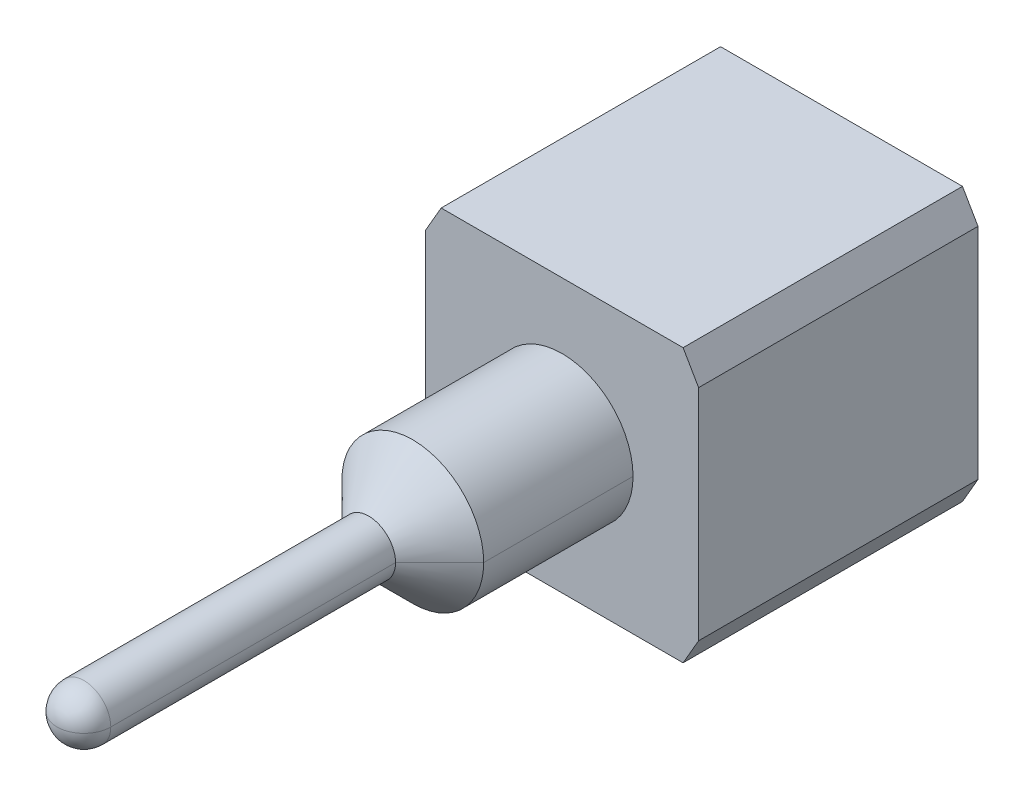
ISO-10303-21;
HEADER;
FILE_DESCRIPTION(('STEP AP214'),'2;1');
FILE_NAME('part.step','',(''),(''),'','','');
FILE_SCHEMA(('AUTOMOTIVE_DESIGN { 1 0 10303 214 1 1 1 1 }'));
ENDSEC;
DATA;
#1=APPLICATION_CONTEXT('core data for automotive mechanical design processes');
#2=APPLICATION_PROTOCOL_DEFINITION('international standard','automotive_design',2000,#1);
#3=PRODUCT_CONTEXT('',#1,'mechanical');
#4=PRODUCT('Part','Part','',(#3));
#5=PRODUCT_RELATED_PRODUCT_CATEGORY('part','',(#4));
#6=PRODUCT_DEFINITION_FORMATION('','',#4);
#7=PRODUCT_DEFINITION_CONTEXT('part definition',#1,'design');
#8=PRODUCT_DEFINITION('design','',#6,#7);
#9=PRODUCT_DEFINITION_SHAPE('','',#8);
#10=(LENGTH_UNIT() NAMED_UNIT(*) SI_UNIT(.MILLI.,.METRE.));
#11=(NAMED_UNIT(*) PLANE_ANGLE_UNIT() SI_UNIT($,.RADIAN.));
#12=(NAMED_UNIT(*) SI_UNIT($,.STERADIAN.) SOLID_ANGLE_UNIT());
#13=UNCERTAINTY_MEASURE_WITH_UNIT(LENGTH_MEASURE(1.E-05),#10,'distance_accuracy_value','');
#14=(GEOMETRIC_REPRESENTATION_CONTEXT(3) GLOBAL_UNCERTAINTY_ASSIGNED_CONTEXT((#13)) GLOBAL_UNIT_ASSIGNED_CONTEXT((#10,
#11,#12)) REPRESENTATION_CONTEXT('',''));
#15=CARTESIAN_POINT('',(0.,0.,0.));
#16=DIRECTION('',(0.,0.,1.));
#17=DIRECTION('',(1.,0.,0.));
#18=AXIS2_PLACEMENT_3D('',#15,#16,#17);
#19=CARTESIAN_POINT('',(22.86,0.,-2.434999997027));
#20=DIRECTION('',(0.,0.,-1.));
#21=DIRECTION('',(0.,-1.,0.));
#22=AXIS2_PLACEMENT_3D('',#19,#20,#21);
#23=CONICAL_SURFACE('',#22,0.484999997027,0.785398163397);
#24=CARTESIAN_POINT('',(22.86,0.,-2.27));
#25=DIRECTION('',(0.,0.,1.));
#26=DIRECTION('',(-1.,0.,0.));
#27=AXIS2_PLACEMENT_3D('',#24,#25,#26);
#28=CIRCLE('',#27,0.32);
#29=CARTESIAN_POINT('',(22.54,0.,-2.27));
#30=VERTEX_POINT('',#29);
#31=CARTESIAN_POINT('',(22.86,-0.32,-2.27));
#32=VERTEX_POINT('',#31);
#33=EDGE_CURVE('E225',#30,#32,#28,.T.);
#34=ORIENTED_EDGE('',*,*,#33,.T.);
#35=DIRECTION('',(0.,-0.707106781186048,-0.707106781187048));
#36=VECTOR('',#35,1.);
#37=CARTESIAN_POINT('',(22.86,-0.484999997027,-2.434999997027));
#38=LINE('',#37,#36);
#39=CARTESIAN_POINT('',(22.86,-0.65,-2.6));
#40=VERTEX_POINT('',#39);
#41=EDGE_CURVE('E295',#32,#40,#38,.T.);
#42=ORIENTED_EDGE('',*,*,#41,.T.);
#43=CARTESIAN_POINT('',(22.86,0.,-2.6));
#44=DIRECTION('',(0.,0.,1.));
#45=DIRECTION('',(-1.,0.,0.));
#46=AXIS2_PLACEMENT_3D('',#43,#44,#45);
#47=CIRCLE('',#46,0.65);
#48=CARTESIAN_POINT('',(22.21,0.,-2.6));
#49=VERTEX_POINT('',#48);
#50=EDGE_CURVE('E204',#49,#40,#47,.T.);
#51=ORIENTED_EDGE('',*,*,#50,.F.);
#52=DIRECTION('',(0.707106781186046,-7.14491332818146E-08,0.707106781187046));
#53=VECTOR('',#52,1.);
#54=CARTESIAN_POINT('',(22.21000000517,5.286343726844E-08,-2.599999994828));
#55=LINE('',#54,#53);
#56=EDGE_CURVE('E197',#49,#30,#55,.T.);
#57=ORIENTED_EDGE('',*,*,#56,.T.);
#58=EDGE_LOOP('',(#34,#42,#51,#57));
#59=FACE_BOUND('',#58,.T.);
#60=ADVANCED_FACE('F16',(#59),#23,.F.);
#61=CARTESIAN_POINT('',(22.86,0.,4.45));
#62=DIRECTION('',(0.,0.,1.));
#63=DIRECTION('',(1.,0.,0.));
#64=AXIS2_PLACEMENT_3D('',#61,#62,#63);
#65=SPHERICAL_SURFACE('',#64,0.25);
#66=CARTESIAN_POINT('',(22.86,0.,4.45));
#67=DIRECTION('',(0.,-1.,0.));
#68=DIRECTION('',(0.,0.,1.));
#69=AXIS2_PLACEMENT_3D('',#66,#67,#68);
#70=CIRCLE('',#69,0.25);
#71=CARTESIAN_POINT('',(22.86,0.,4.7));
#72=VERTEX_POINT('',#71);
#73=CARTESIAN_POINT('',(22.61,0.,4.45));
#74=VERTEX_POINT('',#73);
#75=EDGE_CURVE('E27',#72,#74,#70,.T.);
#76=ORIENTED_EDGE('',*,*,#75,.T.);
#77=CARTESIAN_POINT('',(22.86,0.,4.45));
#78=DIRECTION('',(0.,0.,-1.));
#79=DIRECTION('',(1.,0.,0.));
#80=AXIS2_PLACEMENT_3D('',#77,#78,#79);
#81=CIRCLE('',#80,0.25);
#82=CARTESIAN_POINT('',(23.11,0.,4.45));
#83=VERTEX_POINT('',#82);
#84=EDGE_CURVE('E246',#83,#74,#81,.T.);
#85=ORIENTED_EDGE('',*,*,#84,.F.);
#86=CARTESIAN_POINT('',(22.86,0.,4.45));
#87=DIRECTION('',(0.,-1.,0.));
#88=DIRECTION('',(0.,0.,1.));
#89=AXIS2_PLACEMENT_3D('',#86,#87,#88);
#90=CIRCLE('',#89,0.25);
#91=EDGE_CURVE('E10',#83,#72,#90,.T.);
#92=ORIENTED_EDGE('',*,*,#91,.T.);
#93=EDGE_LOOP('',(#76,#85,#92));
#94=FACE_BOUND('',#93,.T.);
#95=ADVANCED_FACE('F455',(#94),#65,.T.);
#96=CARTESIAN_POINT('',(22.86,0.,4.45));
#97=DIRECTION('',(0.,0.,1.));
#98=DIRECTION('',(1.,0.,0.));
#99=AXIS2_PLACEMENT_3D('',#96,#97,#98);
#100=SPHERICAL_SURFACE('',#99,0.25);
#101=CARTESIAN_POINT('',(22.86,0.,4.45));
#102=DIRECTION('',(0.,0.,1.));
#103=DIRECTION('',(1.,0.,0.));
#104=AXIS2_PLACEMENT_3D('',#101,#102,#103);
#105=CIRCLE('',#104,0.25);
#106=EDGE_CURVE('E291',#83,#74,#105,.T.);
#107=ORIENTED_EDGE('',*,*,#106,.T.);
#108=ORIENTED_EDGE('',*,*,#75,.F.);
#109=ORIENTED_EDGE('',*,*,#91,.F.);
#110=EDGE_LOOP('',(#107,#108,#109));
#111=FACE_BOUND('',#110,.T.);
#112=ADVANCED_FACE('F448',(#111),#100,.T.);
#113=CARTESIAN_POINT('',(22.86,0.,4.935));
#114=DIRECTION('',(0.,0.,-1.));
#115=DIRECTION('',(1.,0.,0.));
#116=AXIS2_PLACEMENT_3D('',#113,#114,#115);
#117=CYLINDRICAL_SURFACE('',#116,0.25);
#118=CARTESIAN_POINT('',(22.86,0.,1.8));
#119=DIRECTION('',(0.,0.,1.));
#120=DIRECTION('',(1.,0.,0.));
#121=AXIS2_PLACEMENT_3D('',#118,#119,#120);
#122=CIRCLE('',#121,0.25);
#123=CARTESIAN_POINT('',(23.11,0.,1.8));
#124=VERTEX_POINT('',#123);
#125=CARTESIAN_POINT('',(22.61,0.,1.8));
#126=VERTEX_POINT('',#125);
#127=EDGE_CURVE('E304',#124,#126,#122,.T.);
#128=ORIENTED_EDGE('',*,*,#127,.T.);
#129=DIRECTION('',(0.,0.,-1.));
#130=VECTOR('',#129,1.);
#131=CARTESIAN_POINT('',(22.61,0.,4.45));
#132=LINE('',#131,#130);
#133=EDGE_CURVE('E318',#74,#126,#132,.T.);
#134=ORIENTED_EDGE('',*,*,#133,.F.);
#135=ORIENTED_EDGE('',*,*,#106,.F.);
#136=DIRECTION('',(0.,0.,-1.));
#137=VECTOR('',#136,1.);
#138=CARTESIAN_POINT('',(23.11,0.,4.45));
#139=LINE('',#138,#137);
#140=EDGE_CURVE('E373',#83,#124,#139,.T.);
#141=ORIENTED_EDGE('',*,*,#140,.T.);
#142=EDGE_LOOP('',(#128,#134,#135,#141));
#143=FACE_BOUND('',#142,.T.);
#144=ADVANCED_FACE('F443',(#143),#117,.T.);
#145=CARTESIAN_POINT('',(22.86,0.,4.935));
#146=DIRECTION('',(0.,0.,-1.));
#147=DIRECTION('',(1.,0.,0.));
#148=AXIS2_PLACEMENT_3D('',#145,#146,#147);
#149=CYLINDRICAL_SURFACE('',#148,0.25);
#150=ORIENTED_EDGE('',*,*,#84,.T.);
#151=ORIENTED_EDGE('',*,*,#133,.T.);
#152=CARTESIAN_POINT('',(22.86,0.,1.8));
#153=DIRECTION('',(0.,0.,-1.));
#154=DIRECTION('',(1.,0.,0.));
#155=AXIS2_PLACEMENT_3D('',#152,#153,#154);
#156=CIRCLE('',#155,0.25);
#157=EDGE_CURVE('E242',#124,#126,#156,.T.);
#158=ORIENTED_EDGE('',*,*,#157,.F.);
#159=ORIENTED_EDGE('',*,*,#140,.F.);
#160=EDGE_LOOP('',(#150,#151,#158,#159));
#161=FACE_BOUND('',#160,.T.);
#162=ADVANCED_FACE('F447',(#161),#149,.T.);
#163=CARTESIAN_POINT('',(22.86,0.,1.595));
#164=DIRECTION('',(0.,0.,-1.));
#165=DIRECTION('',(1.,0.,0.));
#166=AXIS2_PLACEMENT_3D('',#163,#164,#165);
#167=CONICAL_SURFACE('',#166,0.455,0.785398163397);
#168=ORIENTED_EDGE('',*,*,#157,.T.);
#169=DIRECTION('',(-0.707106781186048,0.,-0.707106781187048));
#170=VECTOR('',#169,1.);
#171=CARTESIAN_POINT('',(22.61,0.,1.8));
#172=LINE('',#171,#170);
#173=CARTESIAN_POINT('',(22.2,0.,1.39));
#174=VERTEX_POINT('',#173);
#175=EDGE_CURVE('E240',#126,#174,#172,.T.);
#176=ORIENTED_EDGE('',*,*,#175,.T.);
#177=CARTESIAN_POINT('',(22.86,0.,1.39));
#178=DIRECTION('',(0.,0.,-1.));
#179=DIRECTION('',(1.,0.,0.));
#180=AXIS2_PLACEMENT_3D('',#177,#178,#179);
#181=CIRCLE('',#180,0.66);
#182=CARTESIAN_POINT('',(23.52,0.,1.39));
#183=VERTEX_POINT('',#182);
#184=EDGE_CURVE('E254',#183,#174,#181,.T.);
#185=ORIENTED_EDGE('',*,*,#184,.F.);
#186=DIRECTION('',(0.707106781186548,0.,-0.707106781186548));
#187=VECTOR('',#186,1.);
#188=CARTESIAN_POINT('',(23.11,0.,1.8));
#189=LINE('',#188,#187);
#190=EDGE_CURVE('E247',#124,#183,#189,.T.);
#191=ORIENTED_EDGE('',*,*,#190,.F.);
#192=EDGE_LOOP('',(#168,#176,#185,#191));
#193=FACE_BOUND('',#192,.T.);
#194=ADVANCED_FACE('F435',(#193),#167,.T.);
#195=CARTESIAN_POINT('',(22.86,0.,1.595));
#196=DIRECTION('',(0.,0.,-1.));
#197=DIRECTION('',(1.,0.,0.));
#198=AXIS2_PLACEMENT_3D('',#195,#196,#197);
#199=CONICAL_SURFACE('',#198,0.455,0.785398163397);
#200=CARTESIAN_POINT('',(22.86,0.,1.39));
#201=DIRECTION('',(0.,0.,1.));
#202=DIRECTION('',(1.,0.,0.));
#203=AXIS2_PLACEMENT_3D('',#200,#201,#202);
#204=CIRCLE('',#203,0.66);
#205=EDGE_CURVE('E236',#183,#174,#204,.T.);
#206=ORIENTED_EDGE('',*,*,#205,.T.);
#207=ORIENTED_EDGE('',*,*,#175,.F.);
#208=ORIENTED_EDGE('',*,*,#127,.F.);
#209=ORIENTED_EDGE('',*,*,#190,.T.);
#210=EDGE_LOOP('',(#206,#207,#208,#209));
#211=FACE_BOUND('',#210,.T.);
#212=ADVANCED_FACE('F428',(#211),#199,.T.);
#213=CARTESIAN_POINT('',(22.86,0.,4.935));
#214=DIRECTION('',(0.,0.,-1.));
#215=DIRECTION('',(1.,0.,0.));
#216=AXIS2_PLACEMENT_3D('',#213,#214,#215);
#217=CYLINDRICAL_SURFACE('',#216,0.66);
#218=CARTESIAN_POINT('',(22.86,0.,0.));
#219=DIRECTION('',(0.,0.,-1.));
#220=DIRECTION('',(-1.,0.,0.));
#221=AXIS2_PLACEMENT_3D('',#218,#219,#220);
#222=CIRCLE('',#221,0.66);
#223=CARTESIAN_POINT('',(22.2,0.,0.));
#224=VERTEX_POINT('',#223);
#225=CARTESIAN_POINT('',(23.52,0.,0.));
#226=VERTEX_POINT('',#225);
#227=EDGE_CURVE('E231',#224,#226,#222,.T.);
#228=ORIENTED_EDGE('',*,*,#227,.F.);
#229=DIRECTION('',(0.,0.,-1.));
#230=VECTOR('',#229,1.);
#231=CARTESIAN_POINT('',(22.2,0.,1.39));
#232=LINE('',#231,#230);
#233=EDGE_CURVE('E258',#174,#224,#232,.T.);
#234=ORIENTED_EDGE('',*,*,#233,.F.);
#235=ORIENTED_EDGE('',*,*,#205,.F.);
#236=DIRECTION('',(0.,0.,-1.));
#237=VECTOR('',#236,1.);
#238=CARTESIAN_POINT('',(23.52,0.,1.39));
#239=LINE('',#238,#237);
#240=EDGE_CURVE('E241',#183,#226,#239,.T.);
#241=ORIENTED_EDGE('',*,*,#240,.T.);
#242=EDGE_LOOP('',(#228,#234,#235,#241));
#243=FACE_BOUND('',#242,.T.);
#244=ADVANCED_FACE('F434',(#243),#217,.T.);
#245=CARTESIAN_POINT('',(22.86,0.,4.935));
#246=DIRECTION('',(0.,0.,-1.));
#247=DIRECTION('',(1.,0.,0.));
#248=AXIS2_PLACEMENT_3D('',#245,#246,#247);
#249=CYLINDRICAL_SURFACE('',#248,0.66);
#250=ORIENTED_EDGE('',*,*,#184,.T.);
#251=ORIENTED_EDGE('',*,*,#233,.T.);
#252=CARTESIAN_POINT('',(22.86,0.,0.));
#253=DIRECTION('',(0.,0.,-1.));
#254=DIRECTION('',(1.,0.,0.));
#255=AXIS2_PLACEMENT_3D('',#252,#253,#254);
#256=CIRCLE('',#255,0.66);
#257=EDGE_CURVE('E220',#226,#224,#256,.T.);
#258=ORIENTED_EDGE('',*,*,#257,.F.);
#259=ORIENTED_EDGE('',*,*,#240,.F.);
#260=EDGE_LOOP('',(#250,#251,#258,#259));
#261=FACE_BOUND('',#260,.T.);
#262=ADVANCED_FACE('F593',(#261),#249,.T.);
#263=CARTESIAN_POINT('',(22.86,0.,-1.6));
#264=DIRECTION('',(0.,0.,-1.));
#265=DIRECTION('',(0.,-1.,0.));
#266=AXIS2_PLACEMENT_3D('',#263,#264,#265);
#267=PLANE('',#266);
#268=CARTESIAN_POINT('',(22.86,0.,-1.6));
#269=DIRECTION('',(0.,0.,-1.));
#270=DIRECTION('',(-1.,0.,0.));
#271=AXIS2_PLACEMENT_3D('',#268,#269,#270);
#272=CIRCLE('',#271,0.32);
#273=CARTESIAN_POINT('',(22.54,0.,-1.6));
#274=VERTEX_POINT('',#273);
#275=CARTESIAN_POINT('',(23.18,0.,-1.6));
#276=VERTEX_POINT('',#275);
#277=EDGE_CURVE('E259',#274,#276,#272,.T.);
#278=ORIENTED_EDGE('',*,*,#277,.T.);
#279=CARTESIAN_POINT('',(22.86,0.,-1.6));
#280=DIRECTION('',(0.,0.,-1.));
#281=DIRECTION('',(1.,0.,0.));
#282=AXIS2_PLACEMENT_3D('',#279,#280,#281);
#283=CIRCLE('',#282,0.32);
#284=EDGE_CURVE('E226',#276,#274,#283,.T.);
#285=ORIENTED_EDGE('',*,*,#284,.T.);
#286=EDGE_LOOP('',(#278,#285));
#287=FACE_BOUND('',#286,.T.);
#288=ADVANCED_FACE('F18',(#287),#267,.T.);
#289=CARTESIAN_POINT('',(22.86,0.,-2.6));
#290=DIRECTION('',(0.,0.,-1.));
#291=DIRECTION('',(1.,0.,0.));
#292=AXIS2_PLACEMENT_3D('',#289,#290,#291);
#293=CYLINDRICAL_SURFACE('',#292,0.32);
#294=DIRECTION('',(2.850374007973E-09,2.913254870967E-08,1.));
#295=VECTOR('',#294,1.);
#296=CARTESIAN_POINT('',(23.17999999809,-1.951880754065E-08,-2.26999999809));
#297=LINE('',#296,#295);
#298=CARTESIAN_POINT('',(23.18,0.,-2.27));
#299=VERTEX_POINT('',#298);
#300=EDGE_CURVE('E221',#299,#276,#297,.T.);
#301=ORIENTED_EDGE('',*,*,#300,.T.);
#302=ORIENTED_EDGE('',*,*,#277,.F.);
#303=DIRECTION('',(-2.85037931053E-09,-2.913254880841E-08,1.));
#304=VECTOR('',#303,1.);
#305=CARTESIAN_POINT('',(22.54000000191,1.951880760681E-08,-2.26999999809));
#306=LINE('',#305,#304);
#307=EDGE_CURVE('E267',#30,#274,#306,.T.);
#308=ORIENTED_EDGE('',*,*,#307,.F.);
#309=CARTESIAN_POINT('',(22.86,0.,-2.27));
#310=DIRECTION('',(0.,0.,1.));
#311=DIRECTION('',(1.,0.,0.));
#312=AXIS2_PLACEMENT_3D('',#309,#310,#311);
#313=CIRCLE('',#312,0.32);
#314=EDGE_CURVE('E190',#299,#30,#313,.T.);
#315=ORIENTED_EDGE('',*,*,#314,.F.);
#316=EDGE_LOOP('',(#301,#302,#308,#315));
#317=FACE_BOUND('',#316,.T.);
#318=ADVANCED_FACE('F490',(#317),#293,.F.);
#319=CARTESIAN_POINT('',(22.86,0.,-2.6));
#320=DIRECTION('',(0.,0.,-1.));
#321=DIRECTION('',(1.,0.,0.));
#322=AXIS2_PLACEMENT_3D('',#319,#320,#321);
#323=CYLINDRICAL_SURFACE('',#322,0.32);
#324=ORIENTED_EDGE('',*,*,#307,.T.);
#325=ORIENTED_EDGE('',*,*,#284,.F.);
#326=ORIENTED_EDGE('',*,*,#300,.F.);
#327=CARTESIAN_POINT('',(22.86,0.,-2.27));
#328=DIRECTION('',(0.,0.,1.));
#329=DIRECTION('',(-1.,0.,0.));
#330=AXIS2_PLACEMENT_3D('',#327,#328,#329);
#331=CIRCLE('',#330,0.32);
#332=EDGE_CURVE('E185',#32,#299,#331,.T.);
#333=ORIENTED_EDGE('',*,*,#332,.F.);
#334=ORIENTED_EDGE('',*,*,#33,.F.);
#335=EDGE_LOOP('',(#324,#325,#326,#333,#334));
#336=FACE_BOUND('',#335,.T.);
#337=ADVANCED_FACE('F486',(#336),#323,.F.);
#338=CARTESIAN_POINT('',(22.86,0.,-2.434999997027));
#339=DIRECTION('',(0.,0.,-1.));
#340=DIRECTION('',(0.,-1.,0.));
#341=AXIS2_PLACEMENT_3D('',#338,#339,#340);
#342=CONICAL_SURFACE('',#341,0.484999997027,0.785398163397);
#343=ORIENTED_EDGE('',*,*,#41,.F.);
#344=ORIENTED_EDGE('',*,*,#332,.T.);
#345=DIRECTION('',(-0.707106781186046,7.14491338855946E-08,0.707106781187046));
#346=VECTOR('',#345,1.);
#347=CARTESIAN_POINT('',(23.50999999483,-5.286343748406E-08,-2.599999994828));
#348=LINE('',#347,#346);
#349=CARTESIAN_POINT('',(23.51,0.,-2.6));
#350=VERTEX_POINT('',#349);
#351=EDGE_CURVE('E177',#350,#299,#348,.T.);
#352=ORIENTED_EDGE('',*,*,#351,.F.);
#353=CARTESIAN_POINT('',(22.86,0.,-2.6));
#354=DIRECTION('',(0.,0.,1.));
#355=DIRECTION('',(-1.,0.,0.));
#356=AXIS2_PLACEMENT_3D('',#353,#354,#355);
#357=CIRCLE('',#356,0.65);
#358=EDGE_CURVE('E182',#40,#350,#357,.T.);
#359=ORIENTED_EDGE('',*,*,#358,.F.);
#360=EDGE_LOOP('',(#343,#344,#352,#359));
#361=FACE_BOUND('',#360,.T.);
#362=ADVANCED_FACE('F180',(#361),#342,.F.);
#363=CARTESIAN_POINT('',(22.86,0.,-2.434999997027));
#364=DIRECTION('',(0.,0.,-1.));
#365=DIRECTION('',(0.,-1.,0.));
#366=AXIS2_PLACEMENT_3D('',#363,#364,#365);
#367=CONICAL_SURFACE('',#366,0.484999997027,0.785398163397);
#368=ORIENTED_EDGE('',*,*,#351,.T.);
#369=ORIENTED_EDGE('',*,*,#314,.T.);
#370=ORIENTED_EDGE('',*,*,#56,.F.);
#371=CARTESIAN_POINT('',(22.86,0.,-2.6));
#372=DIRECTION('',(0.,0.,1.));
#373=DIRECTION('',(1.,0.,0.));
#374=AXIS2_PLACEMENT_3D('',#371,#372,#373);
#375=CIRCLE('',#374,0.65);
#376=EDGE_CURVE('E194',#350,#49,#375,.T.);
#377=ORIENTED_EDGE('',*,*,#376,.F.);
#378=EDGE_LOOP('',(#368,#369,#370,#377));
#379=FACE_BOUND('',#378,.T.);
#380=ADVANCED_FACE('F195',(#379),#367,.F.);
#381=CARTESIAN_POINT('',(24.13,1.27,0.));
#382=DIRECTION('',(0.,1.,0.));
#383=DIRECTION('',(1.,0.,0.));
#384=AXIS2_PLACEMENT_3D('',#381,#382,#383);
#385=PLANE('',#384);
#386=DIRECTION('',(-1.,0.,0.));
#387=VECTOR('',#386,1.);
#388=CARTESIAN_POINT('',(23.9856624327,1.27,0.));
#389=LINE('',#388,#387);
#390=CARTESIAN_POINT('',(23.9856624327,1.27,0.));
#391=VERTEX_POINT('',#390);
#392=CARTESIAN_POINT('',(21.7343375673,1.27,0.));
#393=VERTEX_POINT('',#392);
#394=EDGE_CURVE('E337',#391,#393,#389,.T.);
#395=ORIENTED_EDGE('',*,*,#394,.F.);
#396=DIRECTION('',(0.,0.,-1.));
#397=VECTOR('',#396,1.);
#398=CARTESIAN_POINT('',(23.9856624327,1.27,0.));
#399=LINE('',#398,#397);
#400=CARTESIAN_POINT('',(23.9856624327,1.27,-2.6));
#401=VERTEX_POINT('',#400);
#402=EDGE_CURVE('E191',#391,#401,#399,.T.);
#403=ORIENTED_EDGE('',*,*,#402,.T.);
#404=DIRECTION('',(-1.,0.,0.));
#405=VECTOR('',#404,1.);
#406=CARTESIAN_POINT('',(23.9856624327,1.27,-2.6));
#407=LINE('',#406,#405);
#408=CARTESIAN_POINT('',(21.7343375673,1.27,-2.6));
#409=VERTEX_POINT('',#408);
#410=EDGE_CURVE('E276',#401,#409,#407,.T.);
#411=ORIENTED_EDGE('',*,*,#410,.T.);
#412=DIRECTION('',(0.,0.,-1.));
#413=VECTOR('',#412,1.);
#414=CARTESIAN_POINT('',(21.7343375673,1.27,0.));
#415=LINE('',#414,#413);
#416=EDGE_CURVE('E320',#393,#409,#415,.T.);
#417=ORIENTED_EDGE('',*,*,#416,.F.);
#418=EDGE_LOOP('',(#395,#403,#411,#417));
#419=FACE_BOUND('',#418,.T.);
#420=ADVANCED_FACE('F479',(#419),#385,.T.);
#421=CARTESIAN_POINT('',(24.05783121635,1.145,-1.3));
#422=DIRECTION('',(0.866025403784329,0.50000000000019,0.));
#423=DIRECTION('',(0.,0.,-1.));
#424=AXIS2_PLACEMENT_3D('',#421,#422,#423);
#425=PLANE('',#424);
#426=ORIENTED_EDGE('',*,*,#402,.F.);
#427=DIRECTION('',(-0.50000000000019,0.866025403784329,0.));
#428=VECTOR('',#427,1.);
#429=CARTESIAN_POINT('',(24.13,1.02,0.));
#430=LINE('',#429,#428);
#431=CARTESIAN_POINT('',(24.13,1.02,0.));
#432=VERTEX_POINT('',#431);
#433=EDGE_CURVE('E333',#432,#391,#430,.T.);
#434=ORIENTED_EDGE('',*,*,#433,.F.);
#435=DIRECTION('',(0.,0.,-1.));
#436=VECTOR('',#435,1.);
#437=CARTESIAN_POINT('',(24.13,1.02,0.));
#438=LINE('',#437,#436);
#439=CARTESIAN_POINT('',(24.13,1.02,-2.6));
#440=VERTEX_POINT('',#439);
#441=EDGE_CURVE('E130',#432,#440,#438,.T.);
#442=ORIENTED_EDGE('',*,*,#441,.T.);
#443=DIRECTION('',(0.50000000000019,-0.866025403784329,0.));
#444=VECTOR('',#443,1.);
#445=CARTESIAN_POINT('',(23.9856624327,1.27,-2.6));
#446=LINE('',#445,#444);
#447=EDGE_CURVE('E20',#401,#440,#446,.T.);
#448=ORIENTED_EDGE('',*,*,#447,.F.);
#449=EDGE_LOOP('',(#426,#434,#442,#448));
#450=FACE_BOUND('',#449,.T.);
#451=ADVANCED_FACE('F474',(#450),#425,.T.);
#452=CARTESIAN_POINT('',(24.13,-1.27,0.));
#453=DIRECTION('',(1.,0.,0.));
#454=DIRECTION('',(0.,1.,0.));
#455=AXIS2_PLACEMENT_3D('',#452,#453,#454);
#456=PLANE('',#455);
#457=DIRECTION('',(0.,1.,0.));
#458=VECTOR('',#457,1.);
#459=CARTESIAN_POINT('',(24.13,-1.02,0.));
#460=LINE('',#459,#458);
#461=CARTESIAN_POINT('',(24.13,-1.02,0.));
#462=VERTEX_POINT('',#461);
#463=EDGE_CURVE('E329',#462,#432,#460,.T.);
#464=ORIENTED_EDGE('',*,*,#463,.F.);
#465=DIRECTION('',(0.,0.,-1.));
#466=VECTOR('',#465,1.);
#467=CARTESIAN_POINT('',(24.13,-1.02,0.));
#468=LINE('',#467,#466);
#469=CARTESIAN_POINT('',(24.13,-1.02,-2.6));
#470=VERTEX_POINT('',#469);
#471=EDGE_CURVE('E121',#462,#470,#468,.T.);
#472=ORIENTED_EDGE('',*,*,#471,.T.);
#473=DIRECTION('',(0.,1.,0.));
#474=VECTOR('',#473,1.);
#475=CARTESIAN_POINT('',(24.13,-1.02,-2.6));
#476=LINE('',#475,#474);
#477=EDGE_CURVE('E252',#470,#440,#476,.T.);
#478=ORIENTED_EDGE('',*,*,#477,.T.);
#479=ORIENTED_EDGE('',*,*,#441,.F.);
#480=EDGE_LOOP('',(#464,#472,#478,#479));
#481=FACE_BOUND('',#480,.T.);
#482=ADVANCED_FACE('F478',(#481),#456,.T.);
#483=CARTESIAN_POINT('',(24.05783121635,-1.145,-1.3));
#484=DIRECTION('',(0.866025403784329,-0.50000000000019,0.));
#485=DIRECTION('',(0.,0.,-1.));
#486=AXIS2_PLACEMENT_3D('',#483,#484,#485);
#487=PLANE('',#486);
#488=ORIENTED_EDGE('',*,*,#471,.F.);
#489=DIRECTION('',(0.50000000000019,0.866025403784329,0.));
#490=VECTOR('',#489,1.);
#491=CARTESIAN_POINT('',(23.9856624327,-1.27,0.));
#492=LINE('',#491,#490);
#493=CARTESIAN_POINT('',(23.9856624327,-1.27,0.));
#494=VERTEX_POINT('',#493);
#495=EDGE_CURVE('E334',#494,#462,#492,.T.);
#496=ORIENTED_EDGE('',*,*,#495,.F.);
#497=DIRECTION('',(0.,0.,-1.));
#498=VECTOR('',#497,1.);
#499=CARTESIAN_POINT('',(23.9856624327,-1.27,0.));
#500=LINE('',#499,#498);
#501=CARTESIAN_POINT('',(23.9856624327,-1.27,-2.6));
#502=VERTEX_POINT('',#501);
#503=EDGE_CURVE('E227',#494,#502,#500,.T.);
#504=ORIENTED_EDGE('',*,*,#503,.T.);
#505=DIRECTION('',(-0.50000000000019,-0.866025403784329,0.));
#506=VECTOR('',#505,1.);
#507=CARTESIAN_POINT('',(24.13,-1.02,-2.6));
#508=LINE('',#507,#506);
#509=EDGE_CURVE('E248',#470,#502,#508,.T.);
#510=ORIENTED_EDGE('',*,*,#509,.F.);
#511=EDGE_LOOP('',(#488,#496,#504,#510));
#512=FACE_BOUND('',#511,.T.);
#513=ADVANCED_FACE('F501',(#512),#487,.T.);
#514=CARTESIAN_POINT('',(21.59,-1.27,0.));
#515=DIRECTION('',(0.,-1.,0.));
#516=DIRECTION('',(0.,0.,-1.));
#517=AXIS2_PLACEMENT_3D('',#514,#515,#516);
#518=PLANE('',#517);
#519=DIRECTION('',(1.,0.,0.));
#520=VECTOR('',#519,1.);
#521=CARTESIAN_POINT('',(21.7343375673,-1.27,0.));
#522=LINE('',#521,#520);
#523=CARTESIAN_POINT('',(21.7343375673,-1.27,0.));
#524=VERTEX_POINT('',#523);
#525=EDGE_CURVE('E219',#524,#494,#522,.T.);
#526=ORIENTED_EDGE('',*,*,#525,.F.);
#527=DIRECTION('',(0.,0.,-1.));
#528=VECTOR('',#527,1.);
#529=CARTESIAN_POINT('',(21.7343375673,-1.27,0.));
#530=LINE('',#529,#528);
#531=CARTESIAN_POINT('',(21.7343375673,-1.27,-2.6));
#532=VERTEX_POINT('',#531);
#533=EDGE_CURVE('E230',#524,#532,#530,.T.);
#534=ORIENTED_EDGE('',*,*,#533,.T.);
#535=DIRECTION('',(1.,0.,0.));
#536=VECTOR('',#535,1.);
#537=CARTESIAN_POINT('',(21.7343375673,-1.27,-2.6));
#538=LINE('',#537,#536);
#539=EDGE_CURVE('E251',#532,#502,#538,.T.);
#540=ORIENTED_EDGE('',*,*,#539,.T.);
#541=ORIENTED_EDGE('',*,*,#503,.F.);
#542=EDGE_LOOP('',(#526,#534,#540,#541));
#543=FACE_BOUND('',#542,.T.);
#544=ADVANCED_FACE('F497',(#543),#518,.T.);
#545=CARTESIAN_POINT('',(21.66216878365,-1.145,-1.3));
#546=DIRECTION('',(-0.866025403784329,-0.50000000000019,0.));
#547=DIRECTION('',(-0.50000000000019,0.866025403784329,0.));
#548=AXIS2_PLACEMENT_3D('',#545,#546,#547);
#549=PLANE('',#548);
#550=ORIENTED_EDGE('',*,*,#533,.F.);
#551=DIRECTION('',(0.50000000000019,-0.866025403784329,0.));
#552=VECTOR('',#551,1.);
#553=CARTESIAN_POINT('',(21.59,-1.02,0.));
#554=LINE('',#553,#552);
#555=CARTESIAN_POINT('',(21.59,-1.02,0.));
#556=VERTEX_POINT('',#555);
#557=EDGE_CURVE('E215',#556,#524,#554,.T.);
#558=ORIENTED_EDGE('',*,*,#557,.F.);
#559=DIRECTION('',(0.,0.,-1.));
#560=VECTOR('',#559,1.);
#561=CARTESIAN_POINT('',(21.59,-1.02,0.));
#562=LINE('',#561,#560);
#563=CARTESIAN_POINT('',(21.59,-1.02,-2.6));
#564=VERTEX_POINT('',#563);
#565=EDGE_CURVE('E354',#556,#564,#562,.T.);
#566=ORIENTED_EDGE('',*,*,#565,.T.);
#567=DIRECTION('',(-0.50000000000019,0.866025403784329,0.));
#568=VECTOR('',#567,1.);
#569=CARTESIAN_POINT('',(21.7343375673,-1.27,-2.6));
#570=LINE('',#569,#568);
#571=EDGE_CURVE('E201',#532,#564,#570,.T.);
#572=ORIENTED_EDGE('',*,*,#571,.F.);
#573=EDGE_LOOP('',(#550,#558,#566,#572));
#574=FACE_BOUND('',#573,.T.);
#575=ADVANCED_FACE('F467',(#574),#549,.T.);
#576=CARTESIAN_POINT('',(0.,0.,-2.6));
#577=DIRECTION('',(0.,0.,1.));
#578=DIRECTION('',(1.,0.,0.));
#579=AXIS2_PLACEMENT_3D('',#576,#577,#578);
#580=PLANE('',#579);
#581=ORIENTED_EDGE('',*,*,#571,.T.);
#582=DIRECTION('',(0.,1.,0.));
#583=VECTOR('',#582,1.);
#584=CARTESIAN_POINT('',(21.59,0.,-2.6));
#585=LINE('',#584,#583);
#586=CARTESIAN_POINT('',(21.59,1.019999999998,-2.6));
#587=VERTEX_POINT('',#586);
#588=EDGE_CURVE('E235',#564,#587,#585,.T.);
#589=ORIENTED_EDGE('',*,*,#588,.T.);
#590=DIRECTION('',(0.50000000000019,0.866025403784329,0.));
#591=VECTOR('',#590,1.);
#592=CARTESIAN_POINT('',(21.59,1.02,-2.6));
#593=LINE('',#592,#591);
#594=EDGE_CURVE('E211',#587,#409,#593,.T.);
#595=ORIENTED_EDGE('',*,*,#594,.T.);
#596=ORIENTED_EDGE('',*,*,#410,.F.);
#597=ORIENTED_EDGE('',*,*,#447,.T.);
#598=ORIENTED_EDGE('',*,*,#477,.F.);
#599=ORIENTED_EDGE('',*,*,#509,.T.);
#600=ORIENTED_EDGE('',*,*,#539,.F.);
#601=EDGE_LOOP('',(#581,#589,#595,#596,#597,#598,#599,#600));
#602=FACE_BOUND('',#601,.T.);
#603=ORIENTED_EDGE('',*,*,#50,.T.);
#604=ORIENTED_EDGE('',*,*,#358,.T.);
#605=ORIENTED_EDGE('',*,*,#376,.T.);
#606=EDGE_LOOP('',(#603,#604,#605));
#607=FACE_BOUND('',#606,.T.);
#608=ADVANCED_FACE('F203',(#602,#607),#580,.F.);
#609=CARTESIAN_POINT('',(21.66216878365,1.145,-1.3));
#610=DIRECTION('',(-0.866025403784329,0.50000000000019,0.));
#611=DIRECTION('',(0.,0.,1.));
#612=AXIS2_PLACEMENT_3D('',#609,#610,#611);
#613=PLANE('',#612);
#614=DIRECTION('',(0.,0.,-1.));
#615=VECTOR('',#614,1.);
#616=CARTESIAN_POINT('',(21.59,1.02,0.));
#617=LINE('',#616,#615);
#618=CARTESIAN_POINT('',(21.59,1.019999999996,0.));
#619=VERTEX_POINT('',#618);
#620=EDGE_CURVE('E262',#619,#587,#617,.T.);
#621=ORIENTED_EDGE('',*,*,#620,.F.);
#622=DIRECTION('',(-0.50000000000019,-0.866025403784329,0.));
#623=VECTOR('',#622,1.);
#624=CARTESIAN_POINT('',(21.7343375673,1.27,0.));
#625=LINE('',#624,#623);
#626=EDGE_CURVE('E324',#393,#619,#625,.T.);
#627=ORIENTED_EDGE('',*,*,#626,.F.);
#628=ORIENTED_EDGE('',*,*,#416,.T.);
#629=ORIENTED_EDGE('',*,*,#594,.F.);
#630=EDGE_LOOP('',(#621,#627,#628,#629));
#631=FACE_BOUND('',#630,.T.);
#632=ADVANCED_FACE('F402',(#631),#613,.T.);
#633=CARTESIAN_POINT('',(0.,0.,0.));
#634=DIRECTION('',(0.,0.,1.));
#635=DIRECTION('',(1.,0.,0.));
#636=AXIS2_PLACEMENT_3D('',#633,#634,#635);
#637=PLANE('',#636);
#638=DIRECTION('',(0.,1.,0.));
#639=VECTOR('',#638,1.);
#640=CARTESIAN_POINT('',(21.59,0.,0.));
#641=LINE('',#640,#639);
#642=EDGE_CURVE('E266',#556,#619,#641,.T.);
#643=ORIENTED_EDGE('',*,*,#642,.F.);
#644=ORIENTED_EDGE('',*,*,#557,.T.);
#645=ORIENTED_EDGE('',*,*,#525,.T.);
#646=ORIENTED_EDGE('',*,*,#495,.T.);
#647=ORIENTED_EDGE('',*,*,#463,.T.);
#648=ORIENTED_EDGE('',*,*,#433,.T.);
#649=ORIENTED_EDGE('',*,*,#394,.T.);
#650=ORIENTED_EDGE('',*,*,#626,.T.);
#651=EDGE_LOOP('',(#643,#644,#645,#646,#647,#648,#649,#650));
#652=FACE_BOUND('',#651,.T.);
#653=ORIENTED_EDGE('',*,*,#227,.T.);
#654=ORIENTED_EDGE('',*,*,#257,.T.);
#655=EDGE_LOOP('',(#653,#654));
#656=FACE_BOUND('',#655,.T.);
#657=ADVANCED_FACE('F397',(#652,#656),#637,.T.);
#658=CARTESIAN_POINT('',(21.59,0.,0.));
#659=DIRECTION('',(1.,0.,0.));
#660=DIRECTION('',(0.,1.,0.));
#661=AXIS2_PLACEMENT_3D('',#658,#659,#660);
#662=PLANE('',#661);
#663=ORIENTED_EDGE('',*,*,#565,.F.);
#664=ORIENTED_EDGE('',*,*,#642,.T.);
#665=ORIENTED_EDGE('',*,*,#620,.T.);
#666=ORIENTED_EDGE('',*,*,#588,.F.);
#667=EDGE_LOOP('',(#663,#664,#665,#666));
#668=FACE_BOUND('',#667,.T.);
#669=ADVANCED_FACE('F394',(#668),#662,.F.);
#670=CLOSED_SHELL('',(#60,#95,#112,#144,#162,#194,#212,#244,#262,#288,#318,#337,#362,#380,#420,
#451,#482,#513,#544,#575,#608,#632,#657,#669));
#671=MANIFOLD_SOLID_BREP('B1',#670);
#672=ADVANCED_BREP_SHAPE_REPRESENTATION('',(#18,#671),#14);
#673=SHAPE_DEFINITION_REPRESENTATION(#9,#672);
ENDSEC;
END-ISO-10303-21;
